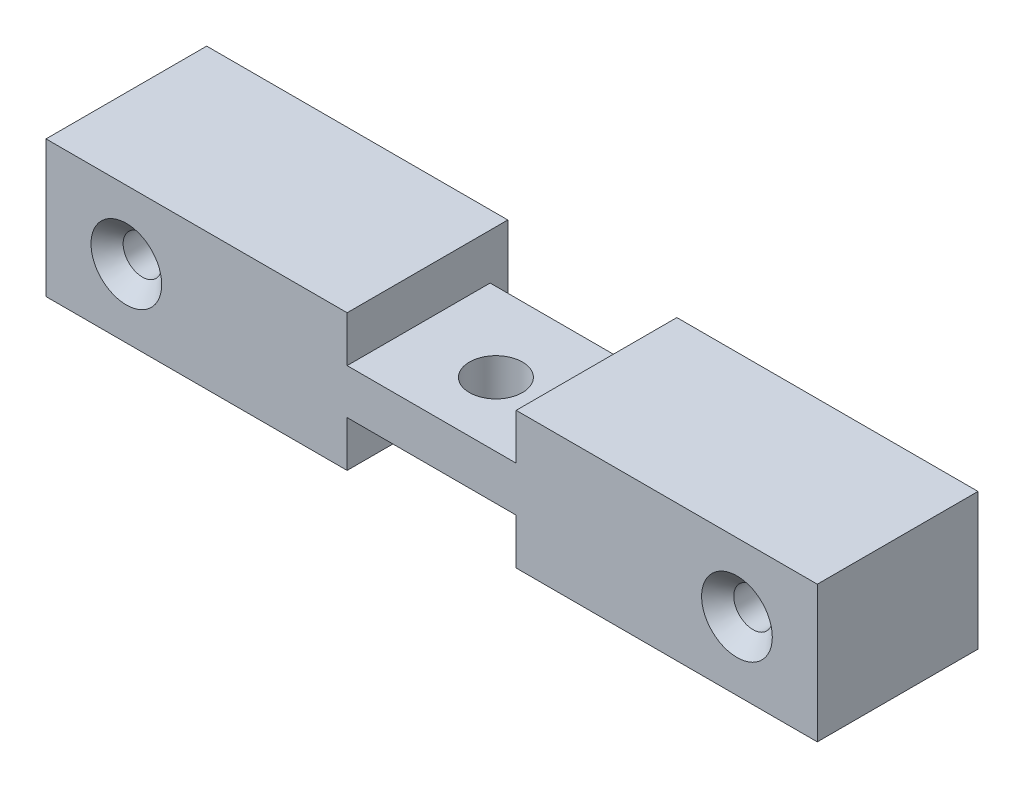
ISO-10303-21;
HEADER;
FILE_DESCRIPTION(('STEP AP214'),'2;1');
FILE_NAME('part.step','',(''),(''),'','','');
FILE_SCHEMA(('AUTOMOTIVE_DESIGN { 1 0 10303 214 1 1 1 1 }'));
ENDSEC;
DATA;
#1=APPLICATION_CONTEXT('core data for automotive mechanical design processes');
#2=APPLICATION_PROTOCOL_DEFINITION('international standard','automotive_design',2000,#1);
#3=PRODUCT_CONTEXT('',#1,'mechanical');
#4=PRODUCT('Part','Part','',(#3));
#5=PRODUCT_RELATED_PRODUCT_CATEGORY('part','',(#4));
#6=PRODUCT_DEFINITION_FORMATION('','',#4);
#7=PRODUCT_DEFINITION_CONTEXT('part definition',#1,'design');
#8=PRODUCT_DEFINITION('design','',#6,#7);
#9=PRODUCT_DEFINITION_SHAPE('','',#8);
#10=(LENGTH_UNIT() NAMED_UNIT(*) SI_UNIT(.MILLI.,.METRE.));
#11=(NAMED_UNIT(*) PLANE_ANGLE_UNIT() SI_UNIT($,.RADIAN.));
#12=(NAMED_UNIT(*) SI_UNIT($,.STERADIAN.) SOLID_ANGLE_UNIT());
#13=UNCERTAINTY_MEASURE_WITH_UNIT(LENGTH_MEASURE(1.E-05),#10,'distance_accuracy_value','');
#14=(GEOMETRIC_REPRESENTATION_CONTEXT(3) GLOBAL_UNCERTAINTY_ASSIGNED_CONTEXT((#13)) GLOBAL_UNIT_ASSIGNED_CONTEXT((#10,
#11,#12)) REPRESENTATION_CONTEXT('',''));
#15=CARTESIAN_POINT('',(0.,0.,0.));
#16=DIRECTION('',(0.,0.,1.));
#17=DIRECTION('',(1.,0.,0.));
#18=AXIS2_PLACEMENT_3D('',#15,#16,#17);
#19=CARTESIAN_POINT('',(-51.1740424962563,8.57918957886186,75.5686531538313));
#20=DIRECTION('',(0.,0.,-1.));
#21=DIRECTION('',(-1.,0.,0.));
#22=AXIS2_PLACEMENT_3D('',#19,#20,#21);
#23=CYLINDRICAL_SURFACE('',#22,2.75);
#24=CARTESIAN_POINT('',(-51.1740424962563,8.57918957886186,44.8999425022208));
#25=DIRECTION('',(0.,0.,-1.));
#26=DIRECTION('',(-1.,0.,0.));
#27=AXIS2_PLACEMENT_3D('',#24,#25,#26);
#28=CIRCLE('',#27,2.75);
#29=CARTESIAN_POINT('',(-53.9240424962563,8.57918957886186,44.8999425022208));
#30=VERTEX_POINT('',#29);
#31=EDGE_CURVE('E181',#30,#30,#28,.T.);
#32=CARTESIAN_POINT('',(-51.1740424962563,8.57918957886186,51.3999425022208));
#33=DIRECTION('',(0.,0.,1.));
#34=DIRECTION('',(1.,0.,0.));
#35=AXIS2_PLACEMENT_3D('',#32,#33,#34);
#36=CIRCLE('',#35,2.75);
#37=CARTESIAN_POINT('',(-53.9240424962563,8.57918957886186,51.3999425022208));
#38=VERTEX_POINT('',#37);
#39=EDGE_CURVE('E11',#38,#38,#36,.F.);
#40=CARTESIAN_POINT('',(-53.9240424962563,8.57918957886186,44.8999425022208));
#41=CARTESIAN_POINT('',(-53.9240424962563,8.57918957886186,44.9676508355541));
#42=CARTESIAN_POINT('',(-53.9240424962563,8.57918957886186,45.0353591688875));
#43=CARTESIAN_POINT('',(-53.9240424962563,8.57918957886186,45.1707758355541));
#44=CARTESIAN_POINT('',(-53.9240424962563,8.57918957886186,45.2384841688875));
#45=CARTESIAN_POINT('',(-53.9240424962563,8.57918957886186,45.3739008355541));
#46=CARTESIAN_POINT('',(-53.9240424962563,8.57918957886186,45.4416091688875));
#47=CARTESIAN_POINT('',(-53.9240424962563,8.57918957886186,45.5770258355541));
#48=CARTESIAN_POINT('',(-53.9240424962563,8.57918957886186,45.6447341688875));
#49=CARTESIAN_POINT('',(-53.9240424962563,8.57918957886186,45.7801508355541));
#50=CARTESIAN_POINT('',(-53.9240424962563,8.57918957886186,45.8478591688875));
#51=CARTESIAN_POINT('',(-53.9240424962563,8.57918957886186,45.9832758355541));
#52=CARTESIAN_POINT('',(-53.9240424962563,8.57918957886186,46.0509841688875));
#53=CARTESIAN_POINT('',(-53.9240424962563,8.57918957886186,46.1864008355541));
#54=CARTESIAN_POINT('',(-53.9240424962563,8.57918957886186,46.2541091688875));
#55=CARTESIAN_POINT('',(-53.9240424962563,8.57918957886186,46.3895258355541));
#56=CARTESIAN_POINT('',(-53.9240424962563,8.57918957886186,46.4572341688875));
#57=CARTESIAN_POINT('',(-53.9240424962563,8.57918957886186,46.5926508355541));
#58=CARTESIAN_POINT('',(-53.9240424962563,8.57918957886186,46.6603591688875));
#59=CARTESIAN_POINT('',(-53.9240424962563,8.57918957886186,46.7957758355541));
#60=CARTESIAN_POINT('',(-53.9240424962563,8.57918957886186,46.8634841688875));
#61=CARTESIAN_POINT('',(-53.9240424962563,8.57918957886186,46.9989008355541));
#62=CARTESIAN_POINT('',(-53.9240424962563,8.57918957886186,47.0666091688875));
#63=CARTESIAN_POINT('',(-53.9240424962563,8.57918957886186,47.2020258355541));
#64=CARTESIAN_POINT('',(-53.9240424962563,8.57918957886186,47.2697341688875));
#65=CARTESIAN_POINT('',(-53.9240424962563,8.57918957886186,47.4051508355541));
#66=CARTESIAN_POINT('',(-53.9240424962563,8.57918957886186,47.4728591688875));
#67=CARTESIAN_POINT('',(-53.9240424962563,8.57918957886186,47.6082758355541));
#68=CARTESIAN_POINT('',(-53.9240424962563,8.57918957886186,47.6759841688875));
#69=CARTESIAN_POINT('',(-53.9240424962563,8.57918957886186,47.8114008355541));
#70=CARTESIAN_POINT('',(-53.9240424962563,8.57918957886186,47.8791091688875));
#71=CARTESIAN_POINT('',(-53.9240424962563,8.57918957886186,48.0145258355541));
#72=CARTESIAN_POINT('',(-53.9240424962563,8.57918957886186,48.0822341688875));
#73=CARTESIAN_POINT('',(-53.9240424962563,8.57918957886186,48.2176508355541));
#74=CARTESIAN_POINT('',(-53.9240424962563,8.57918957886186,48.2853591688875));
#75=CARTESIAN_POINT('',(-53.9240424962563,8.57918957886186,48.4207758355541));
#76=CARTESIAN_POINT('',(-53.9240424962563,8.57918957886186,48.4884841688875));
#77=CARTESIAN_POINT('',(-53.9240424962563,8.57918957886186,48.6239008355541));
#78=CARTESIAN_POINT('',(-53.9240424962563,8.57918957886186,48.6916091688875));
#79=CARTESIAN_POINT('',(-53.9240424962563,8.57918957886186,48.8270258355541));
#80=CARTESIAN_POINT('',(-53.9240424962563,8.57918957886186,48.8947341688875));
#81=CARTESIAN_POINT('',(-53.9240424962563,8.57918957886186,49.0301508355541));
#82=CARTESIAN_POINT('',(-53.9240424962563,8.57918957886186,49.0978591688875));
#83=CARTESIAN_POINT('',(-53.9240424962563,8.57918957886186,49.2332758355541));
#84=CARTESIAN_POINT('',(-53.9240424962563,8.57918957886186,49.3009841688875));
#85=CARTESIAN_POINT('',(-53.9240424962563,8.57918957886186,49.4364008355541));
#86=CARTESIAN_POINT('',(-53.9240424962563,8.57918957886186,49.5041091688875));
#87=CARTESIAN_POINT('',(-53.9240424962563,8.57918957886186,49.6395258355541));
#88=CARTESIAN_POINT('',(-53.9240424962563,8.57918957886186,49.7072341688875));
#89=CARTESIAN_POINT('',(-53.9240424962563,8.57918957886186,49.8426508355541));
#90=CARTESIAN_POINT('',(-53.9240424962563,8.57918957886186,49.9103591688875));
#91=CARTESIAN_POINT('',(-53.9240424962563,8.57918957886186,50.0457758355541));
#92=CARTESIAN_POINT('',(-53.9240424962563,8.57918957886186,50.1134841688875));
#93=CARTESIAN_POINT('',(-53.9240424962563,8.57918957886186,50.2489008355541));
#94=CARTESIAN_POINT('',(-53.9240424962563,8.57918957886186,50.3166091688875));
#95=CARTESIAN_POINT('',(-53.9240424962563,8.57918957886186,50.4520258355541));
#96=CARTESIAN_POINT('',(-53.9240424962563,8.57918957886186,50.5197341688875));
#97=CARTESIAN_POINT('',(-53.9240424962563,8.57918957886186,50.6551508355541));
#98=CARTESIAN_POINT('',(-53.9240424962563,8.57918957886186,50.7228591688875));
#99=CARTESIAN_POINT('',(-53.9240424962563,8.57918957886186,50.8582758355541));
#100=CARTESIAN_POINT('',(-53.9240424962563,8.57918957886186,50.9259841688875));
#101=CARTESIAN_POINT('',(-53.9240424962563,8.57918957886186,51.0614008355541));
#102=CARTESIAN_POINT('',(-53.9240424962563,8.57918957886186,51.1291091688875));
#103=CARTESIAN_POINT('',(-53.9240424962563,8.57918957886186,51.2645258355541));
#104=CARTESIAN_POINT('',(-53.9240424962563,8.57918957886186,51.3322341688875));
#105=CARTESIAN_POINT('',(-53.9240424962563,8.57918957886186,51.3999425022208));
#106=B_SPLINE_CURVE_WITH_KNOTS('',3,(#40,#41,#42,#43,#44,#45,#46,#47,#48,#49,#50,#51,#52,#53,
#54,#55,#56,#57,#58,#59,#60,#61,#62,#63,#64,#65,#66,#67,#68,#69,#70,#71,#72,#73,#74,#75,#76,#77,
#78,#79,#80,#81,#82,#83,#84,#85,#86,#87,#88,#89,#90,#91,#92,#93,#94,#95,#96,#97,#98,#99,#100,
#101,#102,#103,#104,#105),.UNSPECIFIED.,.F.,.F.,(4,2,2,2,2,2,2,2,2,2,2,2,2,2,2,2,2,2,2,2,2,2,2,
2,2,2,2,2,2,2,2,2,4),(0.,0.203124999999998,0.406250000000004,0.609375000000002,
0.812500000000008,1.01562500000001,1.21875,1.421875,1.625,1.828125,2.03125,2.234375,2.4375,
2.640625,2.84375,3.046875,3.25,3.453125,3.65625,3.859375,4.0625,4.26562499999999,
4.46874999999999,4.67187499999999,4.875,5.078125,5.28125,5.484375,5.6875,5.890625,
6.09374999999999,6.29687499999999,6.49999999999999),.UNSPECIFIED.);
#107=EDGE_CURVE('BSEAM47',#30,#38,#106,.T.);
#108=ORIENTED_EDGE('',*,*,#31,.T.);
#109=ORIENTED_EDGE('',*,*,#39,.F.);
#110=ORIENTED_EDGE('',*,*,#107,.T.);
#111=ORIENTED_EDGE('',*,*,#107,.F.);
#112=EDGE_LOOP('',(#108,#110,#109,#111));
#113=FACE_BOUND('',#112,.T.);
#114=ADVANCED_FACE('F47',(#113),#23,.F.);
#115=CARTESIAN_POINT('',(-13.1740424962563,8.57918957886186,75.5686531538313));
#116=DIRECTION('',(0.,0.,-1.));
#117=DIRECTION('',(-1.,0.,0.));
#118=AXIS2_PLACEMENT_3D('',#115,#116,#117);
#119=CYLINDRICAL_SURFACE('',#118,2.75);
#120=CARTESIAN_POINT('',(-13.1740424962563,8.57918957886186,44.8999425022208));
#121=DIRECTION('',(0.,0.,-1.));
#122=DIRECTION('',(1.,0.,0.));
#123=AXIS2_PLACEMENT_3D('',#120,#121,#122);
#124=CIRCLE('',#123,2.75);
#125=CARTESIAN_POINT('',(-15.9240424962563,8.57918957886186,44.8999425022208));
#126=VERTEX_POINT('',#125);
#127=EDGE_CURVE('E185',#126,#126,#124,.T.);
#128=CARTESIAN_POINT('',(-13.1740424962563,8.57918957886186,51.3999425022208));
#129=DIRECTION('',(0.,0.,1.));
#130=DIRECTION('',(1.,0.,0.));
#131=AXIS2_PLACEMENT_3D('',#128,#129,#130);
#132=CIRCLE('',#131,2.75);
#133=CARTESIAN_POINT('',(-15.9240424962563,8.57918957886186,51.3999425022208));
#134=VERTEX_POINT('',#133);
#135=EDGE_CURVE('E56',#134,#134,#132,.F.);
#136=CARTESIAN_POINT('',(-15.9240424962563,8.57918957886186,44.8999425022208));
#137=CARTESIAN_POINT('',(-15.9240424962563,8.57918957886186,44.9676508355541));
#138=CARTESIAN_POINT('',(-15.9240424962563,8.57918957886186,45.0353591688875));
#139=CARTESIAN_POINT('',(-15.9240424962563,8.57918957886186,45.1707758355541));
#140=CARTESIAN_POINT('',(-15.9240424962563,8.57918957886186,45.2384841688875));
#141=CARTESIAN_POINT('',(-15.9240424962563,8.57918957886186,45.3739008355541));
#142=CARTESIAN_POINT('',(-15.9240424962563,8.57918957886186,45.4416091688875));
#143=CARTESIAN_POINT('',(-15.9240424962563,8.57918957886186,45.5770258355541));
#144=CARTESIAN_POINT('',(-15.9240424962563,8.57918957886186,45.6447341688875));
#145=CARTESIAN_POINT('',(-15.9240424962563,8.57918957886186,45.7801508355541));
#146=CARTESIAN_POINT('',(-15.9240424962563,8.57918957886186,45.8478591688875));
#147=CARTESIAN_POINT('',(-15.9240424962563,8.57918957886186,45.9832758355541));
#148=CARTESIAN_POINT('',(-15.9240424962563,8.57918957886186,46.0509841688875));
#149=CARTESIAN_POINT('',(-15.9240424962563,8.57918957886186,46.1864008355541));
#150=CARTESIAN_POINT('',(-15.9240424962563,8.57918957886186,46.2541091688875));
#151=CARTESIAN_POINT('',(-15.9240424962563,8.57918957886186,46.3895258355541));
#152=CARTESIAN_POINT('',(-15.9240424962563,8.57918957886186,46.4572341688875));
#153=CARTESIAN_POINT('',(-15.9240424962563,8.57918957886186,46.5926508355541));
#154=CARTESIAN_POINT('',(-15.9240424962563,8.57918957886186,46.6603591688875));
#155=CARTESIAN_POINT('',(-15.9240424962563,8.57918957886186,46.7957758355541));
#156=CARTESIAN_POINT('',(-15.9240424962563,8.57918957886186,46.8634841688875));
#157=CARTESIAN_POINT('',(-15.9240424962563,8.57918957886186,46.9989008355541));
#158=CARTESIAN_POINT('',(-15.9240424962563,8.57918957886186,47.0666091688875));
#159=CARTESIAN_POINT('',(-15.9240424962563,8.57918957886186,47.2020258355541));
#160=CARTESIAN_POINT('',(-15.9240424962563,8.57918957886186,47.2697341688875));
#161=CARTESIAN_POINT('',(-15.9240424962563,8.57918957886186,47.4051508355541));
#162=CARTESIAN_POINT('',(-15.9240424962563,8.57918957886186,47.4728591688875));
#163=CARTESIAN_POINT('',(-15.9240424962563,8.57918957886186,47.6082758355541));
#164=CARTESIAN_POINT('',(-15.9240424962563,8.57918957886186,47.6759841688875));
#165=CARTESIAN_POINT('',(-15.9240424962563,8.57918957886186,47.8114008355541));
#166=CARTESIAN_POINT('',(-15.9240424962563,8.57918957886186,47.8791091688875));
#167=CARTESIAN_POINT('',(-15.9240424962563,8.57918957886186,48.0145258355541));
#168=CARTESIAN_POINT('',(-15.9240424962563,8.57918957886186,48.0822341688875));
#169=CARTESIAN_POINT('',(-15.9240424962563,8.57918957886186,48.2176508355541));
#170=CARTESIAN_POINT('',(-15.9240424962563,8.57918957886186,48.2853591688875));
#171=CARTESIAN_POINT('',(-15.9240424962563,8.57918957886186,48.4207758355541));
#172=CARTESIAN_POINT('',(-15.9240424962563,8.57918957886186,48.4884841688875));
#173=CARTESIAN_POINT('',(-15.9240424962563,8.57918957886186,48.6239008355541));
#174=CARTESIAN_POINT('',(-15.9240424962563,8.57918957886186,48.6916091688875));
#175=CARTESIAN_POINT('',(-15.9240424962563,8.57918957886186,48.8270258355541));
#176=CARTESIAN_POINT('',(-15.9240424962563,8.57918957886186,48.8947341688875));
#177=CARTESIAN_POINT('',(-15.9240424962563,8.57918957886186,49.0301508355541));
#178=CARTESIAN_POINT('',(-15.9240424962563,8.57918957886186,49.0978591688875));
#179=CARTESIAN_POINT('',(-15.9240424962563,8.57918957886186,49.2332758355541));
#180=CARTESIAN_POINT('',(-15.9240424962563,8.57918957886186,49.3009841688875));
#181=CARTESIAN_POINT('',(-15.9240424962563,8.57918957886186,49.4364008355541));
#182=CARTESIAN_POINT('',(-15.9240424962563,8.57918957886186,49.5041091688875));
#183=CARTESIAN_POINT('',(-15.9240424962563,8.57918957886186,49.6395258355541));
#184=CARTESIAN_POINT('',(-15.9240424962563,8.57918957886186,49.7072341688875));
#185=CARTESIAN_POINT('',(-15.9240424962563,8.57918957886186,49.8426508355541));
#186=CARTESIAN_POINT('',(-15.9240424962563,8.57918957886186,49.9103591688875));
#187=CARTESIAN_POINT('',(-15.9240424962563,8.57918957886186,50.0457758355541));
#188=CARTESIAN_POINT('',(-15.9240424962563,8.57918957886186,50.1134841688875));
#189=CARTESIAN_POINT('',(-15.9240424962563,8.57918957886186,50.2489008355541));
#190=CARTESIAN_POINT('',(-15.9240424962563,8.57918957886186,50.3166091688875));
#191=CARTESIAN_POINT('',(-15.9240424962563,8.57918957886186,50.4520258355541));
#192=CARTESIAN_POINT('',(-15.9240424962563,8.57918957886186,50.5197341688875));
#193=CARTESIAN_POINT('',(-15.9240424962563,8.57918957886186,50.6551508355541));
#194=CARTESIAN_POINT('',(-15.9240424962563,8.57918957886186,50.7228591688875));
#195=CARTESIAN_POINT('',(-15.9240424962563,8.57918957886186,50.8582758355541));
#196=CARTESIAN_POINT('',(-15.9240424962563,8.57918957886186,50.9259841688875));
#197=CARTESIAN_POINT('',(-15.9240424962563,8.57918957886186,51.0614008355541));
#198=CARTESIAN_POINT('',(-15.9240424962563,8.57918957886186,51.1291091688875));
#199=CARTESIAN_POINT('',(-15.9240424962563,8.57918957886186,51.2645258355541));
#200=CARTESIAN_POINT('',(-15.9240424962563,8.57918957886186,51.3322341688875));
#201=CARTESIAN_POINT('',(-15.9240424962563,8.57918957886186,51.3999425022208));
#202=B_SPLINE_CURVE_WITH_KNOTS('',3,(#136,#137,#138,#139,#140,#141,#142,#143,#144,#145,#146,
#147,#148,#149,#150,#151,#152,#153,#154,#155,#156,#157,#158,#159,#160,#161,#162,#163,#164,#165,
#166,#167,#168,#169,#170,#171,#172,#173,#174,#175,#176,#177,#178,#179,#180,#181,#182,#183,#184,
#185,#186,#187,#188,#189,#190,#191,#192,#193,#194,#195,#196,#197,#198,#199,#200,#201),
.UNSPECIFIED.,.F.,.F.,(4,2,2,2,2,2,2,2,2,2,2,2,2,2,2,2,2,2,2,2,2,2,2,2,2,2,2,2,2,2,2,2,4),(0.,
0.203124999999998,0.406250000000004,0.609375000000002,0.812500000000008,1.01562500000001,
1.21875,1.421875,1.625,1.828125,2.03125,2.234375,2.4375,2.640625,2.84375,3.046875,3.25,3.453125,
3.65625,3.859375,4.0625,4.26562499999999,4.46874999999999,4.67187499999999,4.875,5.078125,
5.28125,5.484375,5.6875,5.890625,6.09374999999999,6.29687499999999,6.49999999999999),.UNSPECIFIED.);
#203=EDGE_CURVE('BSEAM287',#126,#134,#202,.T.);
#204=ORIENTED_EDGE('',*,*,#127,.T.);
#205=ORIENTED_EDGE('',*,*,#135,.F.);
#206=ORIENTED_EDGE('',*,*,#203,.T.);
#207=ORIENTED_EDGE('',*,*,#203,.F.);
#208=EDGE_LOOP('',(#204,#206,#205,#207));
#209=FACE_BOUND('',#208,.T.);
#210=ADVANCED_FACE('F287',(#209),#119,.F.);
#211=CARTESIAN_POINT('',(-8.17404249625625,12.8291895788619,75.5686531538313));
#212=DIRECTION('',(1.,0.,0.));
#213=DIRECTION('',(0.,0.,-1.));
#214=AXIS2_PLACEMENT_3D('',#211,#212,#213);
#215=PLANE('',#214);
#216=DIRECTION('',(0.,1.,0.));
#217=VECTOR('',#216,1.);
#218=CARTESIAN_POINT('',(-8.17404249625625,12.8291895788619,54.8999425022208));
#219=LINE('',#218,#217);
#220=CARTESIAN_POINT('',(-8.17404249625625,4.32918957886186,54.8999425022208));
#221=VERTEX_POINT('',#220);
#222=CARTESIAN_POINT('',(-8.17404249625625,12.8291895788619,54.8999425022208));
#223=VERTEX_POINT('',#222);
#224=EDGE_CURVE('E215',#221,#223,#219,.T.);
#225=ORIENTED_EDGE('',*,*,#224,.F.);
#226=DIRECTION('',(0.,0.,-1.));
#227=VECTOR('',#226,1.);
#228=CARTESIAN_POINT('',(-8.17404249625625,4.32918957886186,75.5686531538313));
#229=LINE('',#228,#227);
#230=CARTESIAN_POINT('',(-8.17404249625625,4.32918957886186,44.8999425022208));
#231=VERTEX_POINT('',#230);
#232=EDGE_CURVE('E201',#221,#231,#229,.T.);
#233=ORIENTED_EDGE('',*,*,#232,.T.);
#234=DIRECTION('',(0.,-1.,0.));
#235=VECTOR('',#234,1.);
#236=CARTESIAN_POINT('',(-8.17404249625625,12.8291895788619,44.8999425022208));
#237=LINE('',#236,#235);
#238=CARTESIAN_POINT('',(-8.17404249625625,12.8291895788619,44.8999425022208));
#239=VERTEX_POINT('',#238);
#240=EDGE_CURVE('E200',#239,#231,#237,.T.);
#241=ORIENTED_EDGE('',*,*,#240,.F.);
#242=DIRECTION('',(0.,0.,-1.));
#243=VECTOR('',#242,1.);
#244=CARTESIAN_POINT('',(-8.17404249625625,12.8291895788619,75.5686531538313));
#245=LINE('',#244,#243);
#246=EDGE_CURVE('E197',#223,#239,#245,.T.);
#247=ORIENTED_EDGE('',*,*,#246,.F.);
#248=EDGE_LOOP('',(#225,#233,#241,#247));
#249=FACE_BOUND('',#248,.T.);
#250=ADVANCED_FACE('F284',(#249),#215,.T.);
#251=CARTESIAN_POINT('',(-56.1740424962563,12.8291895788619,75.5686531538313));
#252=DIRECTION('',(-1.,0.,0.));
#253=DIRECTION('',(0.,0.,1.));
#254=AXIS2_PLACEMENT_3D('',#251,#252,#253);
#255=PLANE('',#254);
#256=DIRECTION('',(0.,-1.,0.));
#257=VECTOR('',#256,1.);
#258=CARTESIAN_POINT('',(-56.1740424962563,12.8291895788619,54.8999425022208));
#259=LINE('',#258,#257);
#260=CARTESIAN_POINT('',(-56.1740424962563,12.8291895788619,54.8999425022208));
#261=VERTEX_POINT('',#260);
#262=CARTESIAN_POINT('',(-56.1740424962563,4.32918957886186,54.8999425022208));
#263=VERTEX_POINT('',#262);
#264=EDGE_CURVE('E177',#261,#263,#259,.T.);
#265=ORIENTED_EDGE('',*,*,#264,.F.);
#266=DIRECTION('',(0.,0.,-1.));
#267=VECTOR('',#266,1.);
#268=CARTESIAN_POINT('',(-56.1740424962563,12.8291895788619,75.5686531538313));
#269=LINE('',#268,#267);
#270=CARTESIAN_POINT('',(-56.1740424962563,12.8291895788619,44.8999425022208));
#271=VERTEX_POINT('',#270);
#272=EDGE_CURVE('E179',#261,#271,#269,.T.);
#273=ORIENTED_EDGE('',*,*,#272,.T.);
#274=DIRECTION('',(0.,1.,0.));
#275=VECTOR('',#274,1.);
#276=CARTESIAN_POINT('',(-56.1740424962563,12.8291895788619,44.8999425022208));
#277=LINE('',#276,#275);
#278=CARTESIAN_POINT('',(-56.1740424962563,4.32918957886186,44.8999425022208));
#279=VERTEX_POINT('',#278);
#280=EDGE_CURVE('E187',#279,#271,#277,.T.);
#281=ORIENTED_EDGE('',*,*,#280,.F.);
#282=DIRECTION('',(0.,0.,-1.));
#283=VECTOR('',#282,1.);
#284=CARTESIAN_POINT('',(-56.1740424962563,4.32918957886186,75.5686531538313));
#285=LINE('',#284,#283);
#286=EDGE_CURVE('E193',#263,#279,#285,.T.);
#287=ORIENTED_EDGE('',*,*,#286,.F.);
#288=EDGE_LOOP('',(#265,#273,#281,#287));
#289=FACE_BOUND('',#288,.T.);
#290=ADVANCED_FACE('F286',(#289),#255,.T.);
#291=CARTESIAN_POINT('',(-37.3340424962563,12.8291895788619,75.5686531538313));
#292=DIRECTION('',(0.,1.,0.));
#293=DIRECTION('',(0.,0.,1.));
#294=AXIS2_PLACEMENT_3D('',#291,#292,#293);
#295=PLANE('',#294);
#296=DIRECTION('',(0.,0.,-1.));
#297=VECTOR('',#296,1.);
#298=CARTESIAN_POINT('',(-37.4340424962563,12.8291895788619,54.8999425022208));
#299=LINE('',#298,#297);
#300=CARTESIAN_POINT('',(-37.4340424962563,12.8291895788619,54.8999425022208));
#301=VERTEX_POINT('',#300);
#302=CARTESIAN_POINT('',(-37.4340424962563,12.8291895788619,44.8999425022208));
#303=VERTEX_POINT('',#302);
#304=EDGE_CURVE('E157',#301,#303,#299,.T.);
#305=ORIENTED_EDGE('',*,*,#304,.T.);
#306=DIRECTION('',(1.,0.,0.));
#307=VECTOR('',#306,1.);
#308=CARTESIAN_POINT('',(-37.3340424962563,12.8291895788619,44.8999425022208));
#309=LINE('',#308,#307);
#310=EDGE_CURVE('E190',#271,#303,#309,.T.);
#311=ORIENTED_EDGE('',*,*,#310,.F.);
#312=ORIENTED_EDGE('',*,*,#272,.F.);
#313=DIRECTION('',(-1.,0.,0.));
#314=VECTOR('',#313,1.);
#315=CARTESIAN_POINT('',(-37.3340424962563,12.8291895788619,54.8999425022208));
#316=LINE('',#315,#314);
#317=EDGE_CURVE('E176',#301,#261,#316,.T.);
#318=ORIENTED_EDGE('',*,*,#317,.F.);
#319=EDGE_LOOP('',(#305,#311,#312,#318));
#320=FACE_BOUND('',#319,.T.);
#321=ADVANCED_FACE('F292',(#320),#295,.T.);
#322=CARTESIAN_POINT('',(-56.1740424962563,4.32918957886186,75.5686531538313));
#323=DIRECTION('',(0.,-1.,0.));
#324=DIRECTION('',(0.,0.,-1.));
#325=AXIS2_PLACEMENT_3D('',#322,#323,#324);
#326=PLANE('',#325);
#327=DIRECTION('',(0.,0.,-1.));
#328=VECTOR('',#327,1.);
#329=CARTESIAN_POINT('',(-37.4340424962563,4.32918957886186,54.8999425022208));
#330=LINE('',#329,#328);
#331=CARTESIAN_POINT('',(-37.4340424962563,4.32918957886186,54.8999425022208));
#332=VERTEX_POINT('',#331);
#333=CARTESIAN_POINT('',(-37.4340424962563,4.32918957886186,44.8999425022208));
#334=VERTEX_POINT('',#333);
#335=EDGE_CURVE('E241',#332,#334,#330,.T.);
#336=ORIENTED_EDGE('',*,*,#335,.F.);
#337=DIRECTION('',(1.,0.,0.));
#338=VECTOR('',#337,1.);
#339=CARTESIAN_POINT('',(-56.1740424962563,4.32918957886186,54.8999425022208));
#340=LINE('',#339,#338);
#341=EDGE_CURVE('E173',#263,#332,#340,.T.);
#342=ORIENTED_EDGE('',*,*,#341,.F.);
#343=ORIENTED_EDGE('',*,*,#286,.T.);
#344=DIRECTION('',(-1.,0.,0.));
#345=VECTOR('',#344,1.);
#346=CARTESIAN_POINT('',(-56.1740424962563,4.32918957886186,44.8999425022208));
#347=LINE('',#346,#345);
#348=EDGE_CURVE('E184',#334,#279,#347,.T.);
#349=ORIENTED_EDGE('',*,*,#348,.F.);
#350=EDGE_LOOP('',(#336,#342,#343,#349));
#351=FACE_BOUND('',#350,.T.);
#352=ADVANCED_FACE('F310',(#351),#326,.T.);
#353=CARTESIAN_POINT('',(-44.6740424962563,12.5791895788619,44.8999425022208));
#354=DIRECTION('',(0.,0.,1.));
#355=DIRECTION('',(1.,0.,0.));
#356=AXIS2_PLACEMENT_3D('',#353,#354,#355);
#357=PLANE('',#356);
#358=ORIENTED_EDGE('',*,*,#310,.T.);
#359=DIRECTION('',(0.,1.,0.));
#360=VECTOR('',#359,1.);
#361=CARTESIAN_POINT('',(-37.4340424962563,7.17918957886186,44.8999425022208));
#362=LINE('',#361,#360);
#363=EDGE_CURVE('E162',#334,#303,#362,.T.);
#364=ORIENTED_EDGE('',*,*,#363,.F.);
#365=ORIENTED_EDGE('',*,*,#348,.T.);
#366=ORIENTED_EDGE('',*,*,#280,.T.);
#367=EDGE_LOOP('',(#358,#364,#365,#366));
#368=FACE_BOUND('',#367,.T.);
#369=ORIENTED_EDGE('',*,*,#31,.F.);
#370=EDGE_LOOP('',(#369));
#371=FACE_BOUND('',#370,.T.);
#372=ADVANCED_FACE('F315',(#368,#371),#357,.F.);
#373=CARTESIAN_POINT('',(-27.0140424962563,12.8291895788619,75.5686531538313));
#374=DIRECTION('',(0.,1.,0.));
#375=DIRECTION('',(0.,0.,1.));
#376=AXIS2_PLACEMENT_3D('',#373,#374,#375);
#377=PLANE('',#376);
#378=DIRECTION('',(0.,0.,-1.));
#379=VECTOR('',#378,1.);
#380=CARTESIAN_POINT('',(-26.9140424962563,12.8291895788619,54.8999425022208));
#381=LINE('',#380,#379);
#382=CARTESIAN_POINT('',(-26.9140424962563,12.8291895788619,54.8999425022208));
#383=VERTEX_POINT('',#382);
#384=CARTESIAN_POINT('',(-26.9140424962563,12.8291895788619,44.8999425022208));
#385=VERTEX_POINT('',#384);
#386=EDGE_CURVE('E159',#383,#385,#381,.T.);
#387=ORIENTED_EDGE('',*,*,#386,.F.);
#388=DIRECTION('',(-1.,0.,0.));
#389=VECTOR('',#388,1.);
#390=CARTESIAN_POINT('',(-27.0140424962563,12.8291895788619,54.8999425022208));
#391=LINE('',#390,#389);
#392=EDGE_CURVE('E203',#223,#383,#391,.T.);
#393=ORIENTED_EDGE('',*,*,#392,.F.);
#394=ORIENTED_EDGE('',*,*,#246,.T.);
#395=DIRECTION('',(1.,0.,0.));
#396=VECTOR('',#395,1.);
#397=CARTESIAN_POINT('',(-27.0140424962563,12.8291895788619,44.8999425022208));
#398=LINE('',#397,#396);
#399=EDGE_CURVE('E206',#385,#239,#398,.T.);
#400=ORIENTED_EDGE('',*,*,#399,.F.);
#401=EDGE_LOOP('',(#387,#393,#394,#400));
#402=FACE_BOUND('',#401,.T.);
#403=ADVANCED_FACE('F266',(#402),#377,.T.);
#404=CARTESIAN_POINT('',(-8.17404249625625,4.32918957886186,75.5686531538313));
#405=DIRECTION('',(0.,-1.,0.));
#406=DIRECTION('',(0.,0.,-1.));
#407=AXIS2_PLACEMENT_3D('',#404,#405,#406);
#408=PLANE('',#407);
#409=DIRECTION('',(0.,0.,-1.));
#410=VECTOR('',#409,1.);
#411=CARTESIAN_POINT('',(-26.9140424962563,4.32918957886186,54.8999425022208));
#412=LINE('',#411,#410);
#413=CARTESIAN_POINT('',(-26.9140424962563,4.32918957886186,54.8999425022208));
#414=VERTEX_POINT('',#413);
#415=CARTESIAN_POINT('',(-26.9140424962563,4.32918957886186,44.8999425022208));
#416=VERTEX_POINT('',#415);
#417=EDGE_CURVE('E240',#414,#416,#412,.T.);
#418=ORIENTED_EDGE('',*,*,#417,.T.);
#419=DIRECTION('',(-1.,0.,0.));
#420=VECTOR('',#419,1.);
#421=CARTESIAN_POINT('',(-8.17404249625625,4.32918957886186,44.8999425022208));
#422=LINE('',#421,#420);
#423=EDGE_CURVE('E208',#231,#416,#422,.T.);
#424=ORIENTED_EDGE('',*,*,#423,.F.);
#425=ORIENTED_EDGE('',*,*,#232,.F.);
#426=DIRECTION('',(1.,0.,0.));
#427=VECTOR('',#426,1.);
#428=CARTESIAN_POINT('',(-8.17404249625625,4.32918957886186,54.8999425022208));
#429=LINE('',#428,#427);
#430=EDGE_CURVE('E213',#414,#221,#429,.T.);
#431=ORIENTED_EDGE('',*,*,#430,.F.);
#432=EDGE_LOOP('',(#418,#424,#425,#431));
#433=FACE_BOUND('',#432,.T.);
#434=ADVANCED_FACE('F275',(#433),#408,.T.);
#435=CARTESIAN_POINT('',(-27.0140424962563,12.5791895788619,44.8999425022208));
#436=DIRECTION('',(0.,0.,1.));
#437=DIRECTION('',(1.,0.,0.));
#438=AXIS2_PLACEMENT_3D('',#435,#436,#437);
#439=PLANE('',#438);
#440=DIRECTION('',(0.,-1.,0.));
#441=VECTOR('',#440,1.);
#442=CARTESIAN_POINT('',(-26.9140424962563,4.32918957886186,44.8999425022208));
#443=LINE('',#442,#441);
#444=EDGE_CURVE('E250',#385,#416,#443,.T.);
#445=ORIENTED_EDGE('',*,*,#444,.F.);
#446=ORIENTED_EDGE('',*,*,#399,.T.);
#447=ORIENTED_EDGE('',*,*,#240,.T.);
#448=ORIENTED_EDGE('',*,*,#423,.T.);
#449=EDGE_LOOP('',(#445,#446,#447,#448));
#450=FACE_BOUND('',#449,.T.);
#451=ORIENTED_EDGE('',*,*,#127,.F.);
#452=EDGE_LOOP('',(#451));
#453=FACE_BOUND('',#452,.T.);
#454=ADVANCED_FACE('F270',(#450,#453),#439,.F.);
#455=CARTESIAN_POINT('',(-49.6740424962563,12.5791895788619,54.8999425022208));
#456=DIRECTION('',(0.,0.,-1.));
#457=DIRECTION('',(-1.,0.,0.));
#458=AXIS2_PLACEMENT_3D('',#455,#456,#457);
#459=PLANE('',#458);
#460=CARTESIAN_POINT('',(-51.1740424962563,8.57918957886186,54.8999425022208));
#461=DIRECTION('',(0.,0.,1.));
#462=DIRECTION('',(1.,0.,0.));
#463=AXIS2_PLACEMENT_3D('',#460,#461,#462);
#464=CIRCLE('',#463,2.2);
#465=CARTESIAN_POINT('',(-48.9740424962563,8.57918957886186,54.8999425022208));
#466=VERTEX_POINT('',#465);
#467=EDGE_CURVE('E343',#466,#466,#464,.T.);
#468=ORIENTED_EDGE('',*,*,#467,.F.);
#469=EDGE_LOOP('',(#468));
#470=FACE_BOUND('',#469,.T.);
#471=CARTESIAN_POINT('',(-13.1740424962563,8.57918957886186,54.8999425022208));
#472=DIRECTION('',(0.,0.,1.));
#473=DIRECTION('',(1.,0.,0.));
#474=AXIS2_PLACEMENT_3D('',#471,#472,#473);
#475=CIRCLE('',#474,2.2);
#476=CARTESIAN_POINT('',(-10.9740424962563,8.57918957886186,54.8999425022208));
#477=VERTEX_POINT('',#476);
#478=EDGE_CURVE('E230',#477,#477,#475,.T.);
#479=ORIENTED_EDGE('',*,*,#478,.F.);
#480=EDGE_LOOP('',(#479));
#481=FACE_BOUND('',#480,.T.);
#482=DIRECTION('',(1.,0.,0.));
#483=VECTOR('',#482,1.);
#484=CARTESIAN_POINT('',(-26.9140424962563,7.17918957886186,54.8999425022208));
#485=LINE('',#484,#483);
#486=CARTESIAN_POINT('',(-37.4340424962563,7.17918957886186,54.8999425022208));
#487=VERTEX_POINT('',#486);
#488=CARTESIAN_POINT('',(-26.9140424962563,7.17918957886186,54.8999425022208));
#489=VERTEX_POINT('',#488);
#490=EDGE_CURVE('E256',#487,#489,#485,.T.);
#491=ORIENTED_EDGE('',*,*,#490,.T.);
#492=DIRECTION('',(0.,-1.,0.));
#493=VECTOR('',#492,1.);
#494=CARTESIAN_POINT('',(-26.9140424962563,4.32918957886186,54.8999425022208));
#495=LINE('',#494,#493);
#496=EDGE_CURVE('E243',#489,#414,#495,.T.);
#497=ORIENTED_EDGE('',*,*,#496,.T.);
#498=ORIENTED_EDGE('',*,*,#430,.T.);
#499=ORIENTED_EDGE('',*,*,#224,.T.);
#500=ORIENTED_EDGE('',*,*,#392,.T.);
#501=DIRECTION('',(0.,-1.,0.));
#502=VECTOR('',#501,1.);
#503=CARTESIAN_POINT('',(-26.9140424962563,12.8291895788619,54.8999425022208));
#504=LINE('',#503,#502);
#505=CARTESIAN_POINT('',(-26.9140424962563,9.97918957886186,54.8999425022208));
#506=VERTEX_POINT('',#505);
#507=EDGE_CURVE('E169',#383,#506,#504,.T.);
#508=ORIENTED_EDGE('',*,*,#507,.T.);
#509=DIRECTION('',(-1.,0.,0.));
#510=VECTOR('',#509,1.);
#511=CARTESIAN_POINT('',(-26.9140424962563,9.97918957886186,54.8999425022208));
#512=LINE('',#511,#510);
#513=CARTESIAN_POINT('',(-37.4340424962563,9.97918957886186,54.8999425022208));
#514=VERTEX_POINT('',#513);
#515=EDGE_CURVE('E167',#506,#514,#512,.T.);
#516=ORIENTED_EDGE('',*,*,#515,.T.);
#517=DIRECTION('',(0.,1.,0.));
#518=VECTOR('',#517,1.);
#519=CARTESIAN_POINT('',(-37.4340424962563,9.97918957886186,54.8999425022208));
#520=LINE('',#519,#518);
#521=EDGE_CURVE('E155',#514,#301,#520,.T.);
#522=ORIENTED_EDGE('',*,*,#521,.T.);
#523=ORIENTED_EDGE('',*,*,#317,.T.);
#524=ORIENTED_EDGE('',*,*,#264,.T.);
#525=ORIENTED_EDGE('',*,*,#341,.T.);
#526=DIRECTION('',(0.,1.,0.));
#527=VECTOR('',#526,1.);
#528=CARTESIAN_POINT('',(-37.4340424962563,7.17918957886186,54.8999425022208));
#529=LINE('',#528,#527);
#530=EDGE_CURVE('E72',#332,#487,#529,.T.);
#531=ORIENTED_EDGE('',*,*,#530,.T.);
#532=EDGE_LOOP('',(#491,#497,#498,#499,#500,#508,#516,#522,#523,#524,#525,#531));
#533=FACE_BOUND('',#532,.T.);
#534=ADVANCED_FACE('F49',(#470,#481,#533),#459,.F.);
#535=CARTESIAN_POINT('',(-26.9140424962563,9.97918957886186,54.8999425022208));
#536=DIRECTION('',(0.,-1.,0.));
#537=DIRECTION('',(0.,0.,-1.));
#538=AXIS2_PLACEMENT_3D('',#535,#536,#537);
#539=PLANE('',#538);
#540=CARTESIAN_POINT('',(-32.1740424962563,9.97918957886186,50.8999425022208));
#541=DIRECTION('',(0.,-1.,0.));
#542=DIRECTION('',(0.,0.,-1.));
#543=AXIS2_PLACEMENT_3D('',#540,#541,#542);
#544=CIRCLE('',#543,1.65);
#545=CARTESIAN_POINT('',(-32.1740424962563,9.97918957886186,49.2499425022208));
#546=VERTEX_POINT('',#545);
#547=EDGE_CURVE('E172',#546,#546,#544,.T.);
#548=ORIENTED_EDGE('',*,*,#547,.T.);
#549=EDGE_LOOP('',(#548));
#550=FACE_BOUND('',#549,.T.);
#551=DIRECTION('',(0.,0.,-1.));
#552=VECTOR('',#551,1.);
#553=CARTESIAN_POINT('',(-26.9140424962563,9.97918957886186,54.8999425022208));
#554=LINE('',#553,#552);
#555=CARTESIAN_POINT('',(-26.9140424962563,9.97918957886186,45.9999425022208));
#556=VERTEX_POINT('',#555);
#557=EDGE_CURVE('E150',#506,#556,#554,.T.);
#558=ORIENTED_EDGE('',*,*,#557,.T.);
#559=DIRECTION('',(1.,0.,0.));
#560=VECTOR('',#559,1.);
#561=CARTESIAN_POINT('',(-26.9140424962563,9.97918957886186,45.9999425022208));
#562=LINE('',#561,#560);
#563=CARTESIAN_POINT('',(-37.4340424962563,9.97918957886186,45.9999425022208));
#564=VERTEX_POINT('',#563);
#565=EDGE_CURVE('E139',#564,#556,#562,.T.);
#566=ORIENTED_EDGE('',*,*,#565,.F.);
#567=DIRECTION('',(0.,0.,-1.));
#568=VECTOR('',#567,1.);
#569=CARTESIAN_POINT('',(-37.4340424962563,9.97918957886186,54.8999425022208));
#570=LINE('',#569,#568);
#571=EDGE_CURVE('E148',#514,#564,#570,.T.);
#572=ORIENTED_EDGE('',*,*,#571,.F.);
#573=ORIENTED_EDGE('',*,*,#515,.F.);
#574=EDGE_LOOP('',(#558,#566,#572,#573));
#575=FACE_BOUND('',#574,.T.);
#576=ADVANCED_FACE('F146',(#550,#575),#539,.F.);
#577=CARTESIAN_POINT('',(-26.9140424962563,7.17918957886186,54.8999425022208));
#578=DIRECTION('',(0.,1.,0.));
#579=DIRECTION('',(0.,0.,1.));
#580=AXIS2_PLACEMENT_3D('',#577,#578,#579);
#581=PLANE('',#580);
#582=CARTESIAN_POINT('',(-32.1740424962563,7.17918957886186,50.8999425022208));
#583=DIRECTION('',(0.,1.,0.));
#584=DIRECTION('',(0.,0.,1.));
#585=AXIS2_PLACEMENT_3D('',#582,#583,#584);
#586=CIRCLE('',#585,1.65);
#587=CARTESIAN_POINT('',(-32.1740424962563,7.17918957886186,52.5499425022208));
#588=VERTEX_POINT('',#587);
#589=EDGE_CURVE('E216',#588,#588,#586,.T.);
#590=ORIENTED_EDGE('',*,*,#589,.T.);
#591=EDGE_LOOP('',(#590));
#592=FACE_BOUND('',#591,.T.);
#593=DIRECTION('',(0.,0.,-1.));
#594=VECTOR('',#593,1.);
#595=CARTESIAN_POINT('',(-37.4340424962563,7.17918957886186,54.8999425022208));
#596=LINE('',#595,#594);
#597=CARTESIAN_POINT('',(-37.4340424962563,7.17918957886186,45.9999425022208));
#598=VERTEX_POINT('',#597);
#599=EDGE_CURVE('E244',#487,#598,#596,.T.);
#600=ORIENTED_EDGE('',*,*,#599,.T.);
#601=DIRECTION('',(1.,0.,0.));
#602=VECTOR('',#601,1.);
#603=CARTESIAN_POINT('',(-26.9140424962563,7.17918957886186,45.9999425022208));
#604=LINE('',#603,#602);
#605=CARTESIAN_POINT('',(-26.9140424962563,7.17918957886186,45.9999425022208));
#606=VERTEX_POINT('',#605);
#607=EDGE_CURVE('E141',#598,#606,#604,.T.);
#608=ORIENTED_EDGE('',*,*,#607,.T.);
#609=DIRECTION('',(0.,0.,-1.));
#610=VECTOR('',#609,1.);
#611=CARTESIAN_POINT('',(-26.9140424962563,7.17918957886186,54.8999425022208));
#612=LINE('',#611,#610);
#613=EDGE_CURVE('E246',#489,#606,#612,.T.);
#614=ORIENTED_EDGE('',*,*,#613,.F.);
#615=ORIENTED_EDGE('',*,*,#490,.F.);
#616=EDGE_LOOP('',(#600,#608,#614,#615));
#617=FACE_BOUND('',#616,.T.);
#618=ADVANCED_FACE('F282',(#592,#617),#581,.F.);
#619=CARTESIAN_POINT('',(-26.9140424962563,4.32918957886186,54.8999425022208));
#620=DIRECTION('',(1.,0.,0.));
#621=DIRECTION('',(0.,0.,-1.));
#622=AXIS2_PLACEMENT_3D('',#619,#620,#621);
#623=PLANE('',#622);
#624=ORIENTED_EDGE('',*,*,#613,.T.);
#625=DIRECTION('',(0.,1.,0.));
#626=VECTOR('',#625,1.);
#627=CARTESIAN_POINT('',(-26.9140424962563,4.32918957886186,45.9999425022208));
#628=LINE('',#627,#626);
#629=EDGE_CURVE('E64',#606,#556,#628,.T.);
#630=ORIENTED_EDGE('',*,*,#629,.T.);
#631=ORIENTED_EDGE('',*,*,#557,.F.);
#632=ORIENTED_EDGE('',*,*,#507,.F.);
#633=ORIENTED_EDGE('',*,*,#386,.T.);
#634=ORIENTED_EDGE('',*,*,#444,.T.);
#635=ORIENTED_EDGE('',*,*,#417,.F.);
#636=ORIENTED_EDGE('',*,*,#496,.F.);
#637=EDGE_LOOP('',(#624,#630,#631,#632,#633,#634,#635,#636));
#638=FACE_BOUND('',#637,.T.);
#639=ADVANCED_FACE('F263',(#638),#623,.F.);
#640=CARTESIAN_POINT('',(-37.4340424962563,7.17918957886186,54.8999425022208));
#641=DIRECTION('',(-1.,0.,0.));
#642=DIRECTION('',(0.,0.,1.));
#643=AXIS2_PLACEMENT_3D('',#640,#641,#642);
#644=PLANE('',#643);
#645=ORIENTED_EDGE('',*,*,#335,.T.);
#646=ORIENTED_EDGE('',*,*,#363,.T.);
#647=ORIENTED_EDGE('',*,*,#304,.F.);
#648=ORIENTED_EDGE('',*,*,#521,.F.);
#649=ORIENTED_EDGE('',*,*,#571,.T.);
#650=DIRECTION('',(0.,1.,0.));
#651=VECTOR('',#650,1.);
#652=CARTESIAN_POINT('',(-37.4340424962563,4.32918957886186,45.9999425022208));
#653=LINE('',#652,#651);
#654=EDGE_CURVE('E136',#598,#564,#653,.T.);
#655=ORIENTED_EDGE('',*,*,#654,.F.);
#656=ORIENTED_EDGE('',*,*,#599,.F.);
#657=ORIENTED_EDGE('',*,*,#530,.F.);
#658=EDGE_LOOP('',(#645,#646,#647,#648,#649,#655,#656,#657));
#659=FACE_BOUND('',#658,.T.);
#660=ADVANCED_FACE('F153',(#659),#644,.F.);
#661=CARTESIAN_POINT('',(-32.1740424962563,12.5791895788619,50.8999425022208));
#662=DIRECTION('',(0.,-1.,0.));
#663=DIRECTION('',(0.,0.,-1.));
#664=AXIS2_PLACEMENT_3D('',#661,#662,#663);
#665=CYLINDRICAL_SURFACE('',#664,1.65);
#666=ORIENTED_EDGE('',*,*,#589,.F.);
#667=EDGE_LOOP('',(#666));
#668=FACE_BOUND('',#667,.T.);
#669=ORIENTED_EDGE('',*,*,#547,.F.);
#670=EDGE_LOOP('',(#669));
#671=FACE_BOUND('',#670,.T.);
#672=ADVANCED_FACE('F329',(#668,#671),#665,.F.);
#673=CARTESIAN_POINT('',(-26.9140424962563,4.32918957886186,45.9999425022208));
#674=DIRECTION('',(0.,0.,1.));
#675=DIRECTION('',(1.,0.,0.));
#676=AXIS2_PLACEMENT_3D('',#673,#674,#675);
#677=PLANE('',#676);
#678=ORIENTED_EDGE('',*,*,#654,.T.);
#679=ORIENTED_EDGE('',*,*,#565,.T.);
#680=ORIENTED_EDGE('',*,*,#629,.F.);
#681=ORIENTED_EDGE('',*,*,#607,.F.);
#682=EDGE_LOOP('',(#678,#679,#680,#681));
#683=FACE_BOUND('',#682,.T.);
#684=ADVANCED_FACE('F138',(#683),#677,.F.);
#685=CARTESIAN_POINT('',(-13.1740424962563,8.57918957886186,51.3999425022208));
#686=DIRECTION('',(0.,0.,1.));
#687=DIRECTION('',(1.,0.,0.));
#688=AXIS2_PLACEMENT_3D('',#685,#686,#687);
#689=PLANE('',#688);
#690=CARTESIAN_POINT('',(-13.1740424962563,8.57918957886186,51.3999425022208));
#691=DIRECTION('',(0.,0.,1.));
#692=DIRECTION('',(1.,0.,0.));
#693=AXIS2_PLACEMENT_3D('',#690,#691,#692);
#694=CIRCLE('',#693,1.2);
#695=CARTESIAN_POINT('',(-11.9740424962563,8.57918957886186,51.3999425022208));
#696=VERTEX_POINT('',#695);
#697=EDGE_CURVE('E151',#696,#696,#694,.T.);
#698=ORIENTED_EDGE('',*,*,#697,.T.);
#699=EDGE_LOOP('',(#698));
#700=FACE_BOUND('',#699,.T.);
#701=ORIENTED_EDGE('',*,*,#135,.T.);
#702=EDGE_LOOP('',(#701));
#703=FACE_BOUND('',#702,.T.);
#704=ADVANCED_FACE('F365',(#700,#703),#689,.F.);
#705=CARTESIAN_POINT('',(-51.1740424962563,8.57918957886186,51.3999425022208));
#706=DIRECTION('',(0.,0.,1.));
#707=DIRECTION('',(1.,0.,0.));
#708=AXIS2_PLACEMENT_3D('',#705,#706,#707);
#709=PLANE('',#708);
#710=CARTESIAN_POINT('',(-51.1740424962563,8.57918957886186,51.3999425022208));
#711=DIRECTION('',(0.,0.,1.));
#712=DIRECTION('',(1.,0.,0.));
#713=AXIS2_PLACEMENT_3D('',#710,#711,#712);
#714=CIRCLE('',#713,1.2);
#715=CARTESIAN_POINT('',(-49.9740424962563,8.57918957886186,51.3999425022208));
#716=VERTEX_POINT('',#715);
#717=EDGE_CURVE('E51',#716,#716,#714,.T.);
#718=ORIENTED_EDGE('',*,*,#717,.T.);
#719=EDGE_LOOP('',(#718));
#720=FACE_BOUND('',#719,.T.);
#721=ORIENTED_EDGE('',*,*,#39,.T.);
#722=EDGE_LOOP('',(#721));
#723=FACE_BOUND('',#722,.T.);
#724=ADVANCED_FACE('F359',(#720,#723),#709,.F.);
#725=CARTESIAN_POINT('',(-13.1740424962563,8.57918957886186,54.8999425022208));
#726=DIRECTION('',(0.,0.,1.));
#727=DIRECTION('',(1.,0.,0.));
#728=AXIS2_PLACEMENT_3D('',#725,#726,#727);
#729=CYLINDRICAL_SURFACE('',#728,1.2);
#730=CARTESIAN_POINT('',(-13.1740424962563,8.57918957886186,53.8999425022208));
#731=DIRECTION('',(0.,0.,1.));
#732=DIRECTION('',(1.,0.,0.));
#733=AXIS2_PLACEMENT_3D('',#730,#731,#732);
#734=CIRCLE('',#733,1.2);
#735=CARTESIAN_POINT('',(-11.9740424962563,8.57918957886186,53.8999425022208));
#736=VERTEX_POINT('',#735);
#737=EDGE_CURVE('E226',#736,#736,#734,.T.);
#738=ORIENTED_EDGE('',*,*,#737,.T.);
#739=EDGE_LOOP('',(#738));
#740=FACE_BOUND('',#739,.T.);
#741=ORIENTED_EDGE('',*,*,#697,.F.);
#742=EDGE_LOOP('',(#741));
#743=FACE_BOUND('',#742,.T.);
#744=ADVANCED_FACE('F349',(#740,#743),#729,.F.);
#745=CARTESIAN_POINT('',(-13.1740424962563,8.57918957886186,54.8999425022208));
#746=DIRECTION('',(0.,0.,1.));
#747=DIRECTION('',(1.,0.,0.));
#748=AXIS2_PLACEMENT_3D('',#745,#746,#747);
#749=CONICAL_SURFACE('',#748,2.2,0.785398163397449);
#750=ORIENTED_EDGE('',*,*,#737,.F.);
#751=EDGE_LOOP('',(#750));
#752=FACE_BOUND('',#751,.T.);
#753=ORIENTED_EDGE('',*,*,#478,.T.);
#754=EDGE_LOOP('',(#753));
#755=FACE_BOUND('',#754,.T.);
#756=ADVANCED_FACE('F346',(#752,#755),#749,.F.);
#757=CARTESIAN_POINT('',(-51.1740424962563,8.57918957886186,54.8999425022208));
#758=DIRECTION('',(0.,0.,1.));
#759=DIRECTION('',(1.,0.,0.));
#760=AXIS2_PLACEMENT_3D('',#757,#758,#759);
#761=CYLINDRICAL_SURFACE('',#760,1.2);
#762=CARTESIAN_POINT('',(-51.1740424962563,8.57918957886186,53.8999425022208));
#763=DIRECTION('',(0.,0.,1.));
#764=DIRECTION('',(1.,0.,0.));
#765=AXIS2_PLACEMENT_3D('',#762,#763,#764);
#766=CIRCLE('',#765,1.2);
#767=CARTESIAN_POINT('',(-49.9740424962563,8.57918957886186,53.8999425022208));
#768=VERTEX_POINT('',#767);
#769=EDGE_CURVE('E456',#768,#768,#766,.T.);
#770=ORIENTED_EDGE('',*,*,#769,.T.);
#771=EDGE_LOOP('',(#770));
#772=FACE_BOUND('',#771,.T.);
#773=ORIENTED_EDGE('',*,*,#717,.F.);
#774=EDGE_LOOP('',(#773));
#775=FACE_BOUND('',#774,.T.);
#776=ADVANCED_FACE('F348',(#772,#775),#761,.F.);
#777=CARTESIAN_POINT('',(-51.1740424962563,8.57918957886186,54.8999425022208));
#778=DIRECTION('',(0.,0.,1.));
#779=DIRECTION('',(1.,0.,0.));
#780=AXIS2_PLACEMENT_3D('',#777,#778,#779);
#781=CONICAL_SURFACE('',#780,2.2,0.785398163397448);
#782=ORIENTED_EDGE('',*,*,#769,.F.);
#783=EDGE_LOOP('',(#782));
#784=FACE_BOUND('',#783,.T.);
#785=ORIENTED_EDGE('',*,*,#467,.T.);
#786=EDGE_LOOP('',(#785));
#787=FACE_BOUND('',#786,.T.);
#788=ADVANCED_FACE('F356',(#784,#787),#781,.F.);
#789=CLOSED_SHELL('',(#114,#210,#250,#290,#321,#352,#372,#403,#434,#454,#534,#576,#618,#639,
#660,#672,#684,#704,#724,#744,#756,#776,#788));
#790=MANIFOLD_SOLID_BREP('B2',#789);
#791=ADVANCED_BREP_SHAPE_REPRESENTATION('',(#18,#790),#14);
#792=SHAPE_DEFINITION_REPRESENTATION(#9,#791);
ENDSEC;
END-ISO-10303-21;
